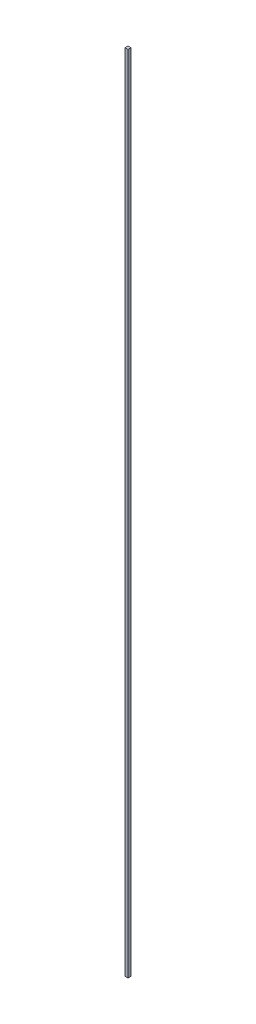
ISO-10303-21;
HEADER;
FILE_DESCRIPTION(('STEP AP214'),'2;1');
FILE_NAME('part.step','',(''),(''),'','','');
FILE_SCHEMA(('AUTOMOTIVE_DESIGN { 1 0 10303 214 1 1 1 1 }'));
ENDSEC;
DATA;
#1=APPLICATION_CONTEXT('core data for automotive mechanical design processes');
#2=APPLICATION_PROTOCOL_DEFINITION('international standard','automotive_design',2000,#1);
#3=PRODUCT_CONTEXT('',#1,'mechanical');
#4=PRODUCT('Part','Part','',(#3));
#5=PRODUCT_RELATED_PRODUCT_CATEGORY('part','',(#4));
#6=PRODUCT_DEFINITION_FORMATION('','',#4);
#7=PRODUCT_DEFINITION_CONTEXT('part definition',#1,'design');
#8=PRODUCT_DEFINITION('design','',#6,#7);
#9=PRODUCT_DEFINITION_SHAPE('','',#8);
#10=(LENGTH_UNIT() NAMED_UNIT(*) SI_UNIT(.MILLI.,.METRE.));
#11=(NAMED_UNIT(*) PLANE_ANGLE_UNIT() SI_UNIT($,.RADIAN.));
#12=(NAMED_UNIT(*) SI_UNIT($,.STERADIAN.) SOLID_ANGLE_UNIT());
#13=UNCERTAINTY_MEASURE_WITH_UNIT(LENGTH_MEASURE(1.E-05),#10,'distance_accuracy_value','');
#14=(GEOMETRIC_REPRESENTATION_CONTEXT(3) GLOBAL_UNCERTAINTY_ASSIGNED_CONTEXT((#13)) GLOBAL_UNIT_ASSIGNED_CONTEXT((#10,
#11,#12)) REPRESENTATION_CONTEXT('',''));
#15=CARTESIAN_POINT('',(0.,0.,0.));
#16=DIRECTION('',(0.,0.,1.));
#17=DIRECTION('',(1.,0.,0.));
#18=AXIS2_PLACEMENT_3D('',#15,#16,#17);
#19=CARTESIAN_POINT('',(0.,541.9,0.));
#20=DIRECTION('',(1.,0.,0.));
#21=DIRECTION('',(0.,0.,-1.));
#22=AXIS2_PLACEMENT_3D('',#19,#20,#21);
#23=PLANE('',#22);
#24=DIRECTION('',(0.,0.,1.));
#25=VECTOR('',#24,1.);
#26=CARTESIAN_POINT('',(0.,0.,0.));
#27=LINE('',#26,#25);
#28=CARTESIAN_POINT('',(0.,0.,-2.));
#29=VERTEX_POINT('',#28);
#30=CARTESIAN_POINT('',(0.,0.,0.));
#31=VERTEX_POINT('',#30);
#32=EDGE_CURVE('E102',#29,#31,#27,.T.);
#33=ORIENTED_EDGE('',*,*,#32,.T.);
#34=DIRECTION('',(0.,-1.,0.));
#35=VECTOR('',#34,1.);
#36=CARTESIAN_POINT('',(0.,541.9,0.));
#37=LINE('',#36,#35);
#38=CARTESIAN_POINT('',(0.,541.9,0.));
#39=VERTEX_POINT('',#38);
#40=EDGE_CURVE('E11',#39,#31,#37,.T.);
#41=ORIENTED_EDGE('',*,*,#40,.F.);
#42=DIRECTION('',(0.,0.,1.));
#43=VECTOR('',#42,1.);
#44=CARTESIAN_POINT('',(0.,541.9,0.));
#45=LINE('',#44,#43);
#46=CARTESIAN_POINT('',(0.,541.9,-2.));
#47=VERTEX_POINT('',#46);
#48=EDGE_CURVE('E90',#47,#39,#45,.T.);
#49=ORIENTED_EDGE('',*,*,#48,.F.);
#50=DIRECTION('',(0.,-1.,0.));
#51=VECTOR('',#50,1.);
#52=CARTESIAN_POINT('',(0.,541.9,-2.));
#53=LINE('',#52,#51);
#54=EDGE_CURVE('E98',#47,#29,#53,.T.);
#55=ORIENTED_EDGE('',*,*,#54,.T.);
#56=EDGE_LOOP('',(#33,#41,#49,#55));
#57=FACE_BOUND('',#56,.T.);
#58=ADVANCED_FACE('F39',(#57),#23,.F.);
#59=CARTESIAN_POINT('',(0.,541.9,0.));
#60=DIRECTION('',(0.,0.,-1.));
#61=DIRECTION('',(-1.,0.,0.));
#62=AXIS2_PLACEMENT_3D('',#59,#60,#61);
#63=PLANE('',#62);
#64=DIRECTION('',(1.,0.,0.));
#65=VECTOR('',#64,1.);
#66=CARTESIAN_POINT('',(0.,0.,0.));
#67=LINE('',#66,#65);
#68=CARTESIAN_POINT('',(2.,0.,0.));
#69=VERTEX_POINT('',#68);
#70=EDGE_CURVE('E94',#31,#69,#67,.T.);
#71=ORIENTED_EDGE('',*,*,#70,.T.);
#72=DIRECTION('',(0.,-1.,0.));
#73=VECTOR('',#72,1.);
#74=CARTESIAN_POINT('',(2.,541.9,0.));
#75=LINE('',#74,#73);
#76=CARTESIAN_POINT('',(2.,541.9,0.));
#77=VERTEX_POINT('',#76);
#78=EDGE_CURVE('E47',#77,#69,#75,.T.);
#79=ORIENTED_EDGE('',*,*,#78,.F.);
#80=DIRECTION('',(1.,0.,0.));
#81=VECTOR('',#80,1.);
#82=CARTESIAN_POINT('',(0.,541.9,0.));
#83=LINE('',#82,#81);
#84=EDGE_CURVE('E85',#39,#77,#83,.T.);
#85=ORIENTED_EDGE('',*,*,#84,.F.);
#86=ORIENTED_EDGE('',*,*,#40,.T.);
#87=EDGE_LOOP('',(#71,#79,#85,#86));
#88=FACE_BOUND('',#87,.T.);
#89=ADVANCED_FACE('F93',(#88),#63,.F.);
#90=CARTESIAN_POINT('',(2.,541.9,0.));
#91=DIRECTION('',(-1.,0.,0.));
#92=DIRECTION('',(0.,0.,1.));
#93=AXIS2_PLACEMENT_3D('',#90,#91,#92);
#94=PLANE('',#93);
#95=DIRECTION('',(0.,0.,-1.));
#96=VECTOR('',#95,1.);
#97=CARTESIAN_POINT('',(2.,0.,0.));
#98=LINE('',#97,#96);
#99=CARTESIAN_POINT('',(2.,0.,-2.));
#100=VERTEX_POINT('',#99);
#101=EDGE_CURVE('E72',#69,#100,#98,.T.);
#102=ORIENTED_EDGE('',*,*,#101,.T.);
#103=DIRECTION('',(0.,-1.,0.));
#104=VECTOR('',#103,1.);
#105=CARTESIAN_POINT('',(2.,541.9,-2.));
#106=LINE('',#105,#104);
#107=CARTESIAN_POINT('',(2.,541.9,-2.));
#108=VERTEX_POINT('',#107);
#109=EDGE_CURVE('E95',#108,#100,#106,.T.);
#110=ORIENTED_EDGE('',*,*,#109,.F.);
#111=DIRECTION('',(0.,0.,-1.));
#112=VECTOR('',#111,1.);
#113=CARTESIAN_POINT('',(2.,541.9,0.));
#114=LINE('',#113,#112);
#115=EDGE_CURVE('E88',#77,#108,#114,.T.);
#116=ORIENTED_EDGE('',*,*,#115,.F.);
#117=ORIENTED_EDGE('',*,*,#78,.T.);
#118=EDGE_LOOP('',(#102,#110,#116,#117));
#119=FACE_BOUND('',#118,.T.);
#120=ADVANCED_FACE('F96',(#119),#94,.F.);
#121=CARTESIAN_POINT('',(0.,541.9,-2.));
#122=DIRECTION('',(0.,0.,1.));
#123=DIRECTION('',(1.,0.,0.));
#124=AXIS2_PLACEMENT_3D('',#121,#122,#123);
#125=PLANE('',#124);
#126=DIRECTION('',(-1.,0.,0.));
#127=VECTOR('',#126,1.);
#128=CARTESIAN_POINT('',(0.,0.,-2.));
#129=LINE('',#128,#127);
#130=EDGE_CURVE('E78',#100,#29,#129,.T.);
#131=ORIENTED_EDGE('',*,*,#130,.T.);
#132=ORIENTED_EDGE('',*,*,#54,.F.);
#133=DIRECTION('',(-1.,0.,0.));
#134=VECTOR('',#133,1.);
#135=CARTESIAN_POINT('',(0.,541.9,-2.));
#136=LINE('',#135,#134);
#137=EDGE_CURVE('E55',#108,#47,#136,.T.);
#138=ORIENTED_EDGE('',*,*,#137,.F.);
#139=ORIENTED_EDGE('',*,*,#109,.T.);
#140=EDGE_LOOP('',(#131,#132,#138,#139));
#141=FACE_BOUND('',#140,.T.);
#142=ADVANCED_FACE('F109',(#141),#125,.F.);
#143=CARTESIAN_POINT('',(0.,541.9,0.));
#144=DIRECTION('',(0.,-1.,0.));
#145=DIRECTION('',(0.,0.,-1.));
#146=AXIS2_PLACEMENT_3D('',#143,#144,#145);
#147=PLANE('',#146);
#148=ORIENTED_EDGE('',*,*,#48,.T.);
#149=ORIENTED_EDGE('',*,*,#84,.T.);
#150=ORIENTED_EDGE('',*,*,#115,.T.);
#151=ORIENTED_EDGE('',*,*,#137,.T.);
#152=EDGE_LOOP('',(#148,#149,#150,#151));
#153=FACE_BOUND('',#152,.T.);
#154=ADVANCED_FACE('F86',(#153),#147,.F.);
#155=CARTESIAN_POINT('',(0.,0.,0.));
#156=DIRECTION('',(0.,-1.,0.));
#157=DIRECTION('',(0.,0.,-1.));
#158=AXIS2_PLACEMENT_3D('',#155,#156,#157);
#159=PLANE('',#158);
#160=ORIENTED_EDGE('',*,*,#32,.F.);
#161=ORIENTED_EDGE('',*,*,#130,.F.);
#162=ORIENTED_EDGE('',*,*,#101,.F.);
#163=ORIENTED_EDGE('',*,*,#70,.F.);
#164=EDGE_LOOP('',(#160,#161,#162,#163));
#165=FACE_BOUND('',#164,.T.);
#166=ADVANCED_FACE('F112',(#165),#159,.T.);
#167=CLOSED_SHELL('',(#58,#89,#120,#142,#154,#166));
#168=MANIFOLD_SOLID_BREP('B2',#167);
#169=ADVANCED_BREP_SHAPE_REPRESENTATION('',(#18,#168),#14);
#170=SHAPE_DEFINITION_REPRESENTATION(#9,#169);
ENDSEC;
END-ISO-10303-21;
